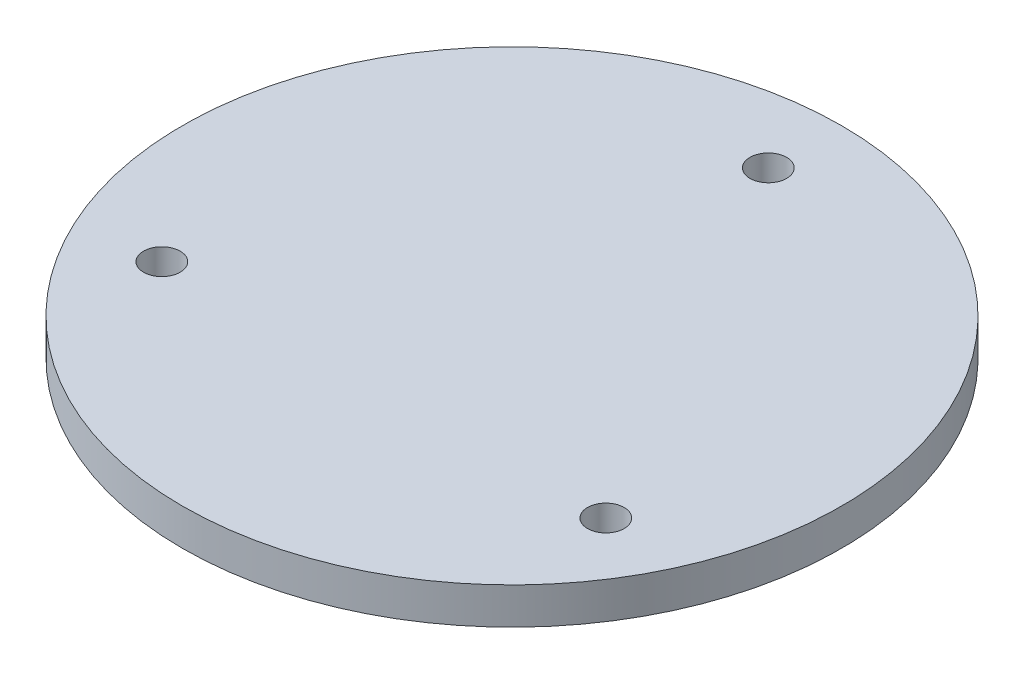
ISO-10303-21;
HEADER;
FILE_DESCRIPTION(('STEP AP214'),'2;1');
FILE_NAME('part.step','',(''),(''),'','','');
FILE_SCHEMA(('AUTOMOTIVE_DESIGN { 1 0 10303 214 1 1 1 1 }'));
ENDSEC;
DATA;
#1=APPLICATION_CONTEXT('core data for automotive mechanical design processes');
#2=APPLICATION_PROTOCOL_DEFINITION('international standard','automotive_design',2000,#1);
#3=PRODUCT_CONTEXT('',#1,'mechanical');
#4=PRODUCT('Part','Part','',(#3));
#5=PRODUCT_RELATED_PRODUCT_CATEGORY('part','',(#4));
#6=PRODUCT_DEFINITION_FORMATION('','',#4);
#7=PRODUCT_DEFINITION_CONTEXT('part definition',#1,'design');
#8=PRODUCT_DEFINITION('design','',#6,#7);
#9=PRODUCT_DEFINITION_SHAPE('','',#8);
#10=(LENGTH_UNIT() NAMED_UNIT(*) SI_UNIT(.MILLI.,.METRE.));
#11=(NAMED_UNIT(*) PLANE_ANGLE_UNIT() SI_UNIT($,.RADIAN.));
#12=(NAMED_UNIT(*) SI_UNIT($,.STERADIAN.) SOLID_ANGLE_UNIT());
#13=UNCERTAINTY_MEASURE_WITH_UNIT(LENGTH_MEASURE(1.E-05),#10,'distance_accuracy_value','');
#14=(GEOMETRIC_REPRESENTATION_CONTEXT(3) GLOBAL_UNCERTAINTY_ASSIGNED_CONTEXT((#13)) GLOBAL_UNIT_ASSIGNED_CONTEXT((#10,
#11,#12)) REPRESENTATION_CONTEXT('',''));
#15=CARTESIAN_POINT('',(0.,0.,0.));
#16=DIRECTION('',(0.,0.,1.));
#17=DIRECTION('',(1.,0.,0.));
#18=AXIS2_PLACEMENT_3D('',#15,#16,#17);
#19=CARTESIAN_POINT('',(0.,12.7,0.));
#20=DIRECTION('',(0.,1.,0.));
#21=DIRECTION('',(0.,0.,1.));
#22=AXIS2_PLACEMENT_3D('',#19,#20,#21);
#23=PLANE('',#22);
#24=CARTESIAN_POINT('',(76.9896583964415,12.7,44.4499999999972));
#25=DIRECTION('',(0.,1.,0.));
#26=DIRECTION('',(0.,0.,1.));
#27=AXIS2_PLACEMENT_3D('',#24,#25,#26);
#28=CIRCLE('',#27,6.35);
#29=CARTESIAN_POINT('',(76.9896583964415,12.7,50.7999999999972));
#30=VERTEX_POINT('',#29);
#31=EDGE_CURVE('E64',#30,#30,#28,.T.);
#32=ORIENTED_EDGE('',*,*,#31,.F.);
#33=EDGE_LOOP('',(#32));
#34=FACE_BOUND('',#33,.T.);
#35=CARTESIAN_POINT('',(0.,12.7,0.));
#36=DIRECTION('',(0.,1.,0.));
#37=DIRECTION('',(0.,0.,1.));
#38=AXIS2_PLACEMENT_3D('',#35,#36,#37);
#39=CIRCLE('',#38,114.3);
#40=CARTESIAN_POINT('',(0.,12.7,114.3));
#41=VERTEX_POINT('',#40);
#42=EDGE_CURVE('E10',#41,#41,#39,.T.);
#43=ORIENTED_EDGE('',*,*,#42,.T.);
#44=EDGE_LOOP('',(#43));
#45=FACE_BOUND('',#44,.T.);
#46=CARTESIAN_POINT('',(0.,12.7,-88.9));
#47=DIRECTION('',(0.,1.,0.));
#48=DIRECTION('',(0.,0.,1.));
#49=AXIS2_PLACEMENT_3D('',#46,#47,#48);
#50=CIRCLE('',#49,6.35);
#51=CARTESIAN_POINT('',(0.,12.7,-82.55));
#52=VERTEX_POINT('',#51);
#53=EDGE_CURVE('E58',#52,#52,#50,.T.);
#54=ORIENTED_EDGE('',*,*,#53,.F.);
#55=EDGE_LOOP('',(#54));
#56=FACE_BOUND('',#55,.T.);
#57=CARTESIAN_POINT('',(-76.9896583964318,12.7,44.4500000000028));
#58=DIRECTION('',(0.,1.,0.));
#59=DIRECTION('',(0.,0.,1.));
#60=AXIS2_PLACEMENT_3D('',#57,#58,#59);
#61=CIRCLE('',#60,6.35);
#62=CARTESIAN_POINT('',(-76.9896583964318,12.7,50.8000000000028));
#63=VERTEX_POINT('',#62);
#64=EDGE_CURVE('E72',#63,#63,#61,.T.);
#65=ORIENTED_EDGE('',*,*,#64,.F.);
#66=EDGE_LOOP('',(#65));
#67=FACE_BOUND('',#66,.T.);
#68=ADVANCED_FACE('F45',(#34,#45,#56,#67),#23,.T.);
#69=CARTESIAN_POINT('',(0.,0.,0.));
#70=DIRECTION('',(0.,1.,0.));
#71=DIRECTION('',(0.,0.,1.));
#72=AXIS2_PLACEMENT_3D('',#69,#70,#71);
#73=PLANE('',#72);
#74=CARTESIAN_POINT('',(0.,0.,0.));
#75=DIRECTION('',(0.,1.,0.));
#76=DIRECTION('',(0.,0.,1.));
#77=AXIS2_PLACEMENT_3D('',#74,#75,#76);
#78=CIRCLE('',#77,114.3);
#79=CARTESIAN_POINT('',(0.,0.,114.3));
#80=VERTEX_POINT('',#79);
#81=EDGE_CURVE('E49',#80,#80,#78,.T.);
#82=ORIENTED_EDGE('',*,*,#81,.F.);
#83=EDGE_LOOP('',(#82));
#84=FACE_BOUND('',#83,.T.);
#85=CARTESIAN_POINT('',(0.,0.,-88.9));
#86=DIRECTION('',(0.,1.,0.));
#87=DIRECTION('',(0.,0.,1.));
#88=AXIS2_PLACEMENT_3D('',#85,#86,#87);
#89=CIRCLE('',#88,6.35);
#90=CARTESIAN_POINT('',(0.,0.,-82.55));
#91=VERTEX_POINT('',#90);
#92=EDGE_CURVE('E60',#91,#91,#89,.T.);
#93=ORIENTED_EDGE('',*,*,#92,.T.);
#94=EDGE_LOOP('',(#93));
#95=FACE_BOUND('',#94,.T.);
#96=CARTESIAN_POINT('',(76.9896583964415,0.,44.4499999999972));
#97=DIRECTION('',(0.,1.,0.));
#98=DIRECTION('',(0.,0.,1.));
#99=AXIS2_PLACEMENT_3D('',#96,#97,#98);
#100=CIRCLE('',#99,6.35);
#101=CARTESIAN_POINT('',(76.9896583964415,0.,50.7999999999972));
#102=VERTEX_POINT('',#101);
#103=EDGE_CURVE('E68',#102,#102,#100,.T.);
#104=ORIENTED_EDGE('',*,*,#103,.T.);
#105=EDGE_LOOP('',(#104));
#106=FACE_BOUND('',#105,.T.);
#107=CARTESIAN_POINT('',(-76.9896583964318,0.,44.4500000000028));
#108=DIRECTION('',(0.,1.,0.));
#109=DIRECTION('',(0.,0.,1.));
#110=AXIS2_PLACEMENT_3D('',#107,#108,#109);
#111=CIRCLE('',#110,6.35);
#112=CARTESIAN_POINT('',(-76.9896583964318,0.,50.8000000000028));
#113=VERTEX_POINT('',#112);
#114=EDGE_CURVE('E76',#113,#113,#111,.T.);
#115=ORIENTED_EDGE('',*,*,#114,.T.);
#116=EDGE_LOOP('',(#115));
#117=FACE_BOUND('',#116,.T.);
#118=ADVANCED_FACE('F88',(#84,#95,#106,#117),#73,.F.);
#119=CARTESIAN_POINT('',(0.,12.7,0.));
#120=DIRECTION('',(0.,-1.,0.));
#121=DIRECTION('',(0.,0.,-1.));
#122=AXIS2_PLACEMENT_3D('',#119,#120,#121);
#123=CYLINDRICAL_SURFACE('',#122,114.3);
#124=ORIENTED_EDGE('',*,*,#42,.F.);
#125=EDGE_LOOP('',(#124));
#126=FACE_BOUND('',#125,.T.);
#127=ORIENTED_EDGE('',*,*,#81,.T.);
#128=EDGE_LOOP('',(#127));
#129=FACE_BOUND('',#128,.T.);
#130=ADVANCED_FACE('F47',(#126,#129),#123,.T.);
#131=CARTESIAN_POINT('',(0.,12.7,-88.9));
#132=DIRECTION('',(0.,-1.,0.));
#133=DIRECTION('',(0.,0.,-1.));
#134=AXIS2_PLACEMENT_3D('',#131,#132,#133);
#135=CYLINDRICAL_SURFACE('',#134,6.35);
#136=ORIENTED_EDGE('',*,*,#53,.T.);
#137=EDGE_LOOP('',(#136));
#138=FACE_BOUND('',#137,.T.);
#139=ORIENTED_EDGE('',*,*,#92,.F.);
#140=EDGE_LOOP('',(#139));
#141=FACE_BOUND('',#140,.T.);
#142=ADVANCED_FACE('F97',(#138,#141),#135,.F.);
#143=CARTESIAN_POINT('',(76.9896583964415,12.7,44.4499999999972));
#144=DIRECTION('',(0.,-1.,0.));
#145=DIRECTION('',(0.,0.,-1.));
#146=AXIS2_PLACEMENT_3D('',#143,#144,#145);
#147=CYLINDRICAL_SURFACE('',#146,6.35);
#148=ORIENTED_EDGE('',*,*,#31,.T.);
#149=EDGE_LOOP('',(#148));
#150=FACE_BOUND('',#149,.T.);
#151=ORIENTED_EDGE('',*,*,#103,.F.);
#152=EDGE_LOOP('',(#151));
#153=FACE_BOUND('',#152,.T.);
#154=ADVANCED_FACE('F100',(#150,#153),#147,.F.);
#155=CARTESIAN_POINT('',(-76.9896583964318,12.7,44.4500000000028));
#156=DIRECTION('',(0.,-1.,0.));
#157=DIRECTION('',(0.,0.,-1.));
#158=AXIS2_PLACEMENT_3D('',#155,#156,#157);
#159=CYLINDRICAL_SURFACE('',#158,6.35);
#160=ORIENTED_EDGE('',*,*,#64,.T.);
#161=EDGE_LOOP('',(#160));
#162=FACE_BOUND('',#161,.T.);
#163=ORIENTED_EDGE('',*,*,#114,.F.);
#164=EDGE_LOOP('',(#163));
#165=FACE_BOUND('',#164,.T.);
#166=ADVANCED_FACE('F84',(#162,#165),#159,.F.);
#167=CLOSED_SHELL('',(#68,#118,#130,#142,#154,#166));
#168=MANIFOLD_SOLID_BREP('B2',#167);
#169=ADVANCED_BREP_SHAPE_REPRESENTATION('',(#18,#168),#14);
#170=SHAPE_DEFINITION_REPRESENTATION(#9,#169);
ENDSEC;
END-ISO-10303-21;
